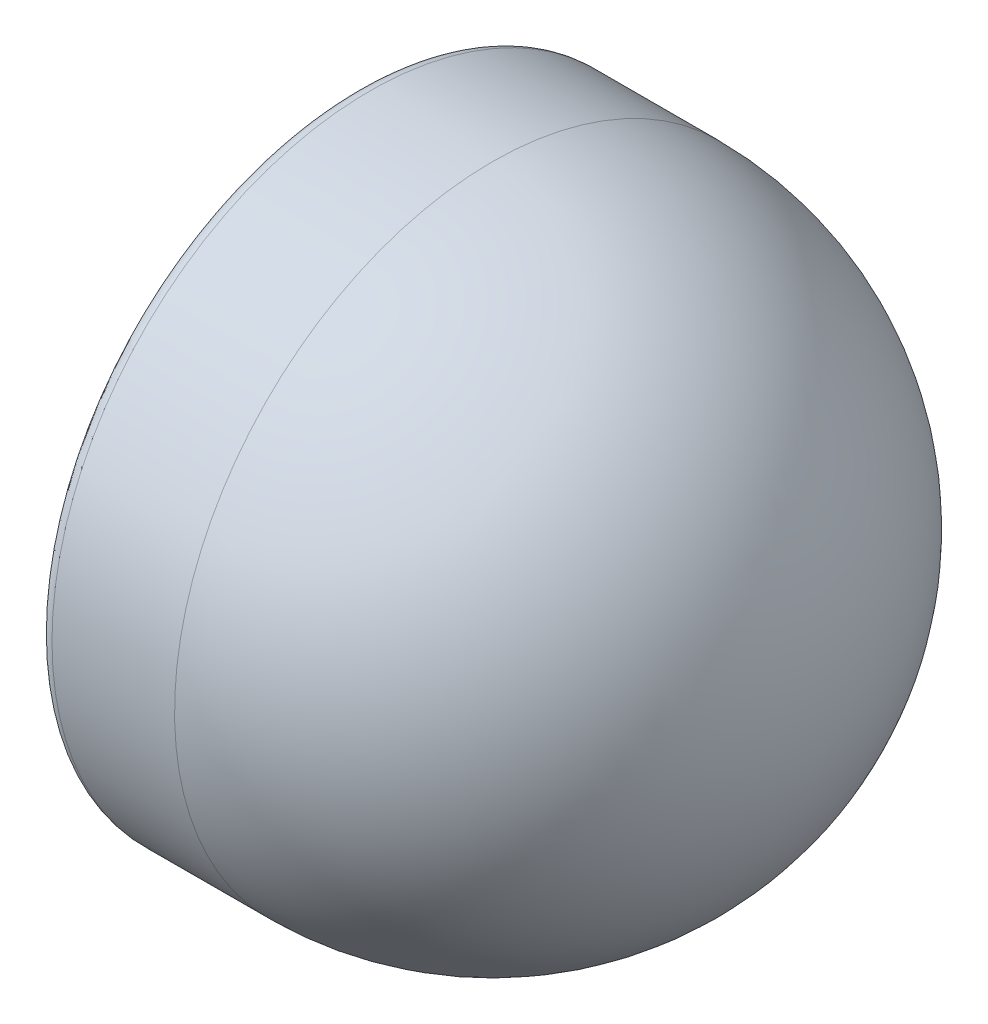
ISO-10303-21;
HEADER;
FILE_DESCRIPTION(('STEP AP214'),'2;1');
FILE_NAME('part.step','',(''),(''),'','','');
FILE_SCHEMA(('AUTOMOTIVE_DESIGN { 1 0 10303 214 1 1 1 1 }'));
ENDSEC;
DATA;
#1=APPLICATION_CONTEXT('core data for automotive mechanical design processes');
#2=APPLICATION_PROTOCOL_DEFINITION('international standard','automotive_design',2000,#1);
#3=PRODUCT_CONTEXT('',#1,'mechanical');
#4=PRODUCT('Part','Part','',(#3));
#5=PRODUCT_RELATED_PRODUCT_CATEGORY('part','',(#4));
#6=PRODUCT_DEFINITION_FORMATION('','',#4);
#7=PRODUCT_DEFINITION_CONTEXT('part definition',#1,'design');
#8=PRODUCT_DEFINITION('design','',#6,#7);
#9=PRODUCT_DEFINITION_SHAPE('','',#8);
#10=(LENGTH_UNIT() NAMED_UNIT(*) SI_UNIT(.MILLI.,.METRE.));
#11=(NAMED_UNIT(*) PLANE_ANGLE_UNIT() SI_UNIT($,.RADIAN.));
#12=(NAMED_UNIT(*) SI_UNIT($,.STERADIAN.) SOLID_ANGLE_UNIT());
#13=UNCERTAINTY_MEASURE_WITH_UNIT(LENGTH_MEASURE(1.E-05),#10,'distance_accuracy_value','');
#14=(GEOMETRIC_REPRESENTATION_CONTEXT(3) GLOBAL_UNCERTAINTY_ASSIGNED_CONTEXT((#13)) GLOBAL_UNIT_ASSIGNED_CONTEXT((#10,
#11,#12)) REPRESENTATION_CONTEXT('',''));
#15=CARTESIAN_POINT('',(0.,0.,0.));
#16=DIRECTION('',(0.,0.,1.));
#17=DIRECTION('',(1.,0.,0.));
#18=AXIS2_PLACEMENT_3D('',#15,#16,#17);
#19=CARTESIAN_POINT('',(-70.,0.,0.));
#20=DIRECTION('',(1.,0.,0.));
#21=DIRECTION('',(0.,1.,0.));
#22=AXIS2_PLACEMENT_3D('',#19,#20,#21);
#23=SPHERICAL_SURFACE('',#22,70.);
#24=CARTESIAN_POINT('',(-70.,0.,0.));
#25=DIRECTION('',(1.,0.,0.));
#26=DIRECTION('',(0.,0.,-1.));
#27=AXIS2_PLACEMENT_3D('',#24,#25,#26);
#28=CIRCLE('',#27,70.);
#29=CARTESIAN_POINT('',(-70.,0.,-70.));
#30=VERTEX_POINT('',#29);
#31=EDGE_CURVE('E10',#30,#30,#28,.T.);
#32=ORIENTED_EDGE('',*,*,#31,.T.);
#33=EDGE_LOOP('',(#32));
#34=FACE_BOUND('',#33,.T.);
#35=ADVANCED_FACE('F41',(#34),#23,.T.);
#36=CARTESIAN_POINT('',(0.,0.,0.));
#37=DIRECTION('',(1.,0.,0.));
#38=DIRECTION('',(0.,0.,-1.));
#39=AXIS2_PLACEMENT_3D('',#36,#37,#38);
#40=CYLINDRICAL_SURFACE('',#39,70.);
#41=CARTESIAN_POINT('',(-97.,0.,0.));
#42=DIRECTION('',(1.,0.,0.));
#43=DIRECTION('',(0.,0.,-1.));
#44=AXIS2_PLACEMENT_3D('',#41,#42,#43);
#45=CIRCLE('',#44,70.);
#46=CARTESIAN_POINT('',(-97.,0.,-70.));
#47=VERTEX_POINT('',#46);
#48=EDGE_CURVE('E48',#47,#47,#45,.T.);
#49=ORIENTED_EDGE('',*,*,#48,.T.);
#50=EDGE_LOOP('',(#49));
#51=FACE_BOUND('',#50,.T.);
#52=ORIENTED_EDGE('',*,*,#31,.F.);
#53=EDGE_LOOP('',(#52));
#54=FACE_BOUND('',#53,.T.);
#55=ADVANCED_FACE('F129',(#51,#54),#40,.T.);
#56=CARTESIAN_POINT('',(-97.,0.,0.));
#57=DIRECTION('',(1.,0.,0.));
#58=DIRECTION('',(0.,0.,-1.));
#59=AXIS2_PLACEMENT_3D('',#56,#57,#58);
#60=TOROIDAL_SURFACE('',#59,67.,3.);
#61=CARTESIAN_POINT('',(-100.,0.,0.));
#62=DIRECTION('',(1.,0.,0.));
#63=DIRECTION('',(0.,0.,-1.));
#64=AXIS2_PLACEMENT_3D('',#61,#62,#63);
#65=CIRCLE('',#64,67.);
#66=CARTESIAN_POINT('',(-100.,0.,-67.));
#67=VERTEX_POINT('',#66);
#68=EDGE_CURVE('E53',#67,#67,#65,.T.);
#69=ORIENTED_EDGE('',*,*,#68,.T.);
#70=EDGE_LOOP('',(#69));
#71=FACE_BOUND('',#70,.T.);
#72=ORIENTED_EDGE('',*,*,#48,.F.);
#73=EDGE_LOOP('',(#72));
#74=FACE_BOUND('',#73,.T.);
#75=ADVANCED_FACE('F133',(#71,#74),#60,.T.);
#76=CARTESIAN_POINT('',(-100.,67.,0.));
#77=DIRECTION('',(-1.,0.,0.));
#78=DIRECTION('',(0.,0.,1.));
#79=AXIS2_PLACEMENT_3D('',#76,#77,#78);
#80=PLANE('',#79);
#81=CARTESIAN_POINT('',(-100.,0.,0.));
#82=DIRECTION('',(1.,0.,0.));
#83=DIRECTION('',(0.,0.,-1.));
#84=AXIS2_PLACEMENT_3D('',#81,#82,#83);
#85=CIRCLE('',#84,61.5);
#86=CARTESIAN_POINT('',(-100.,0.,-61.5));
#87=VERTEX_POINT('',#86);
#88=EDGE_CURVE('E58',#87,#87,#85,.T.);
#89=ORIENTED_EDGE('',*,*,#88,.T.);
#90=EDGE_LOOP('',(#89));
#91=FACE_BOUND('',#90,.T.);
#92=ORIENTED_EDGE('',*,*,#68,.F.);
#93=EDGE_LOOP('',(#92));
#94=FACE_BOUND('',#93,.T.);
#95=ADVANCED_FACE('F137',(#91,#94),#80,.T.);
#96=CARTESIAN_POINT('',(-98.5,0.,0.));
#97=DIRECTION('',(1.,0.,0.));
#98=DIRECTION('',(0.,0.,-1.));
#99=AXIS2_PLACEMENT_3D('',#96,#97,#98);
#100=TOROIDAL_SURFACE('',#99,61.5,1.5);
#101=CARTESIAN_POINT('',(-98.5,0.,0.));
#102=DIRECTION('',(1.,0.,0.));
#103=DIRECTION('',(0.,0.,-1.));
#104=AXIS2_PLACEMENT_3D('',#101,#102,#103);
#105=CIRCLE('',#104,60.);
#106=CARTESIAN_POINT('',(-98.5,0.,-60.));
#107=VERTEX_POINT('',#106);
#108=EDGE_CURVE('E64',#107,#107,#105,.T.);
#109=ORIENTED_EDGE('',*,*,#108,.T.);
#110=EDGE_LOOP('',(#109));
#111=FACE_BOUND('',#110,.T.);
#112=ORIENTED_EDGE('',*,*,#88,.F.);
#113=EDGE_LOOP('',(#112));
#114=FACE_BOUND('',#113,.T.);
#115=ADVANCED_FACE('F144',(#111,#114),#100,.T.);
#116=CARTESIAN_POINT('',(0.,0.,0.));
#117=DIRECTION('',(1.,0.,0.));
#118=DIRECTION('',(0.,0.,-1.));
#119=AXIS2_PLACEMENT_3D('',#116,#117,#118);
#120=CYLINDRICAL_SURFACE('',#119,60.);
#121=CARTESIAN_POINT('',(-96.6213203435597,0.,0.));
#122=DIRECTION('',(1.,0.,0.));
#123=DIRECTION('',(0.,0.,-1.));
#124=AXIS2_PLACEMENT_3D('',#121,#122,#123);
#125=CIRCLE('',#124,60.);
#126=CARTESIAN_POINT('',(-96.6213203435597,0.,-60.));
#127=VERTEX_POINT('',#126);
#128=EDGE_CURVE('E68',#127,#127,#125,.T.);
#129=ORIENTED_EDGE('',*,*,#128,.T.);
#130=EDGE_LOOP('',(#129));
#131=FACE_BOUND('',#130,.T.);
#132=ORIENTED_EDGE('',*,*,#108,.F.);
#133=EDGE_LOOP('',(#132));
#134=FACE_BOUND('',#133,.T.);
#135=ADVANCED_FACE('F148',(#131,#134),#120,.F.);
#136=CARTESIAN_POINT('',(-96.6213203435597,0.,0.));
#137=DIRECTION('',(1.,0.,0.));
#138=DIRECTION('',(0.,0.,-1.));
#139=AXIS2_PLACEMENT_3D('',#136,#137,#138);
#140=TOROIDAL_SURFACE('',#139,61.5,1.5);
#141=CARTESIAN_POINT('',(-95.5606601717798,0.,0.));
#142=DIRECTION('',(1.,0.,0.));
#143=DIRECTION('',(0.,0.,-1.));
#144=AXIS2_PLACEMENT_3D('',#141,#142,#143);
#145=CIRCLE('',#144,60.4393398282202);
#146=CARTESIAN_POINT('',(-95.5606601717798,0.,-60.4393398282202));
#147=VERTEX_POINT('',#146);
#148=EDGE_CURVE('E72',#147,#147,#145,.T.);
#149=ORIENTED_EDGE('',*,*,#148,.T.);
#150=EDGE_LOOP('',(#149));
#151=FACE_BOUND('',#150,.T.);
#152=ORIENTED_EDGE('',*,*,#128,.F.);
#153=EDGE_LOOP('',(#152));
#154=FACE_BOUND('',#153,.T.);
#155=ADVANCED_FACE('F152',(#151,#154),#140,.T.);
#156=CARTESIAN_POINT('',(-95.5606601717798,0.,0.));
#157=DIRECTION('',(1.,0.,0.));
#158=DIRECTION('',(0.,0.,-1.));
#159=AXIS2_PLACEMENT_3D('',#156,#157,#158);
#160=CONICAL_SURFACE('',#159,60.4393398282202,0.785398163397447);
#161=CARTESIAN_POINT('',(-92.,0.,0.));
#162=DIRECTION('',(1.,0.,0.));
#163=DIRECTION('',(0.,0.,-1.));
#164=AXIS2_PLACEMENT_3D('',#161,#162,#163);
#165=CIRCLE('',#164,64.);
#166=CARTESIAN_POINT('',(-92.,0.,-64.));
#167=VERTEX_POINT('',#166);
#168=EDGE_CURVE('E76',#167,#167,#165,.T.);
#169=ORIENTED_EDGE('',*,*,#168,.T.);
#170=EDGE_LOOP('',(#169));
#171=FACE_BOUND('',#170,.T.);
#172=ORIENTED_EDGE('',*,*,#148,.F.);
#173=EDGE_LOOP('',(#172));
#174=FACE_BOUND('',#173,.T.);
#175=ADVANCED_FACE('F156',(#171,#174),#160,.F.);
#176=CARTESIAN_POINT('',(-92.,64.7071067811865,0.));
#177=DIRECTION('',(1.,0.,0.));
#178=DIRECTION('',(0.,0.,-1.));
#179=AXIS2_PLACEMENT_3D('',#176,#177,#178);
#180=PLANE('',#179);
#181=CARTESIAN_POINT('',(-92.,0.,0.));
#182=DIRECTION('',(1.,0.,0.));
#183=DIRECTION('',(0.,0.,-1.));
#184=AXIS2_PLACEMENT_3D('',#181,#182,#183);
#185=CIRCLE('',#184,64.7071067811865);
#186=CARTESIAN_POINT('',(-92.,0.,-64.7071067811865));
#187=VERTEX_POINT('',#186);
#188=EDGE_CURVE('E80',#187,#187,#185,.T.);
#189=ORIENTED_EDGE('',*,*,#188,.T.);
#190=EDGE_LOOP('',(#189));
#191=FACE_BOUND('',#190,.T.);
#192=ORIENTED_EDGE('',*,*,#168,.F.);
#193=EDGE_LOOP('',(#192));
#194=FACE_BOUND('',#193,.T.);
#195=ADVANCED_FACE('F160',(#191,#194),#180,.T.);
#196=CARTESIAN_POINT('',(0.,0.,0.));
#197=DIRECTION('',(1.,0.,0.));
#198=DIRECTION('',(0.,0.,-1.));
#199=AXIS2_PLACEMENT_3D('',#196,#197,#198);
#200=CYLINDRICAL_SURFACE('',#199,64.7071067811865);
#201=CARTESIAN_POINT('',(-92.7071067811866,0.,0.));
#202=DIRECTION('',(1.,0.,0.));
#203=DIRECTION('',(0.,0.,-1.));
#204=AXIS2_PLACEMENT_3D('',#201,#202,#203);
#205=CIRCLE('',#204,64.7071067811865);
#206=CARTESIAN_POINT('',(-92.7071067811866,0.,-64.7071067811865));
#207=VERTEX_POINT('',#206);
#208=EDGE_CURVE('E84',#207,#207,#205,.T.);
#209=ORIENTED_EDGE('',*,*,#208,.T.);
#210=EDGE_LOOP('',(#209));
#211=FACE_BOUND('',#210,.T.);
#212=ORIENTED_EDGE('',*,*,#188,.F.);
#213=EDGE_LOOP('',(#212));
#214=FACE_BOUND('',#213,.T.);
#215=ADVANCED_FACE('F164',(#211,#214),#200,.T.);
#216=CARTESIAN_POINT('',(-92.7071067811866,0.,0.));
#217=DIRECTION('',(1.,0.,0.));
#218=DIRECTION('',(0.,0.,-1.));
#219=AXIS2_PLACEMENT_3D('',#216,#217,#218);
#220=CONICAL_SURFACE('',#219,64.7071067811865,0.785398163397445);
#221=CARTESIAN_POINT('',(-96.2677669529664,0.,0.));
#222=DIRECTION('',(1.,0.,0.));
#223=DIRECTION('',(0.,0.,-1.));
#224=AXIS2_PLACEMENT_3D('',#221,#222,#223);
#225=CIRCLE('',#224,61.1464466094067);
#226=CARTESIAN_POINT('',(-96.2677669529664,0.,-61.1464466094067));
#227=VERTEX_POINT('',#226);
#228=EDGE_CURVE('E88',#227,#227,#225,.T.);
#229=ORIENTED_EDGE('',*,*,#228,.T.);
#230=EDGE_LOOP('',(#229));
#231=FACE_BOUND('',#230,.T.);
#232=ORIENTED_EDGE('',*,*,#208,.F.);
#233=EDGE_LOOP('',(#232));
#234=FACE_BOUND('',#233,.T.);
#235=ADVANCED_FACE('F168',(#231,#234),#220,.T.);
#236=CARTESIAN_POINT('',(-96.6213203435597,0.,0.));
#237=DIRECTION('',(1.,0.,0.));
#238=DIRECTION('',(0.,0.,-1.));
#239=AXIS2_PLACEMENT_3D('',#236,#237,#238);
#240=TOROIDAL_SURFACE('',#239,61.5,0.499999999999999);
#241=CARTESIAN_POINT('',(-96.6213203435597,0.,0.));
#242=DIRECTION('',(1.,0.,0.));
#243=DIRECTION('',(0.,0.,-1.));
#244=AXIS2_PLACEMENT_3D('',#241,#242,#243);
#245=CIRCLE('',#244,61.);
#246=CARTESIAN_POINT('',(-96.6213203435597,0.,-61.));
#247=VERTEX_POINT('',#246);
#248=EDGE_CURVE('E92',#247,#247,#245,.T.);
#249=ORIENTED_EDGE('',*,*,#248,.T.);
#250=EDGE_LOOP('',(#249));
#251=FACE_BOUND('',#250,.T.);
#252=ORIENTED_EDGE('',*,*,#228,.F.);
#253=EDGE_LOOP('',(#252));
#254=FACE_BOUND('',#253,.T.);
#255=ADVANCED_FACE('F172',(#251,#254),#240,.F.);
#256=CARTESIAN_POINT('',(0.,0.,0.));
#257=DIRECTION('',(1.,0.,0.));
#258=DIRECTION('',(0.,0.,-1.));
#259=AXIS2_PLACEMENT_3D('',#256,#257,#258);
#260=CYLINDRICAL_SURFACE('',#259,61.);
#261=CARTESIAN_POINT('',(-98.5,0.,0.));
#262=DIRECTION('',(1.,0.,0.));
#263=DIRECTION('',(0.,0.,-1.));
#264=AXIS2_PLACEMENT_3D('',#261,#262,#263);
#265=CIRCLE('',#264,61.);
#266=CARTESIAN_POINT('',(-98.5,0.,-61.));
#267=VERTEX_POINT('',#266);
#268=EDGE_CURVE('E96',#267,#267,#265,.T.);
#269=ORIENTED_EDGE('',*,*,#268,.T.);
#270=EDGE_LOOP('',(#269));
#271=FACE_BOUND('',#270,.T.);
#272=ORIENTED_EDGE('',*,*,#248,.F.);
#273=EDGE_LOOP('',(#272));
#274=FACE_BOUND('',#273,.T.);
#275=ADVANCED_FACE('F176',(#271,#274),#260,.T.);
#276=CARTESIAN_POINT('',(-98.5,0.,0.));
#277=DIRECTION('',(1.,0.,0.));
#278=DIRECTION('',(0.,0.,-1.));
#279=AXIS2_PLACEMENT_3D('',#276,#277,#278);
#280=TOROIDAL_SURFACE('',#279,61.5,0.5);
#281=CARTESIAN_POINT('',(-99.,0.,0.));
#282=DIRECTION('',(1.,0.,0.));
#283=DIRECTION('',(0.,0.,-1.));
#284=AXIS2_PLACEMENT_3D('',#281,#282,#283);
#285=CIRCLE('',#284,61.5);
#286=CARTESIAN_POINT('',(-99.,0.,-61.5));
#287=VERTEX_POINT('',#286);
#288=EDGE_CURVE('E100',#287,#287,#285,.T.);
#289=ORIENTED_EDGE('',*,*,#288,.T.);
#290=EDGE_LOOP('',(#289));
#291=FACE_BOUND('',#290,.T.);
#292=ORIENTED_EDGE('',*,*,#268,.F.);
#293=EDGE_LOOP('',(#292));
#294=FACE_BOUND('',#293,.T.);
#295=ADVANCED_FACE('F180',(#291,#294),#280,.F.);
#296=CARTESIAN_POINT('',(-99.,67.,0.));
#297=DIRECTION('',(1.,0.,0.));
#298=DIRECTION('',(0.,0.,-1.));
#299=AXIS2_PLACEMENT_3D('',#296,#297,#298);
#300=PLANE('',#299);
#301=CARTESIAN_POINT('',(-99.,0.,0.));
#302=DIRECTION('',(1.,0.,0.));
#303=DIRECTION('',(0.,0.,-1.));
#304=AXIS2_PLACEMENT_3D('',#301,#302,#303);
#305=CIRCLE('',#304,67.);
#306=CARTESIAN_POINT('',(-99.,0.,-67.));
#307=VERTEX_POINT('',#306);
#308=EDGE_CURVE('E104',#307,#307,#305,.T.);
#309=ORIENTED_EDGE('',*,*,#308,.T.);
#310=EDGE_LOOP('',(#309));
#311=FACE_BOUND('',#310,.T.);
#312=ORIENTED_EDGE('',*,*,#288,.F.);
#313=EDGE_LOOP('',(#312));
#314=FACE_BOUND('',#313,.T.);
#315=ADVANCED_FACE('F184',(#311,#314),#300,.T.);
#316=CARTESIAN_POINT('',(-97.,0.,0.));
#317=DIRECTION('',(1.,0.,0.));
#318=DIRECTION('',(0.,0.,-1.));
#319=AXIS2_PLACEMENT_3D('',#316,#317,#318);
#320=TOROIDAL_SURFACE('',#319,67.,2.00000000000001);
#321=CARTESIAN_POINT('',(-97.,0.,0.));
#322=DIRECTION('',(1.,0.,0.));
#323=DIRECTION('',(0.,0.,-1.));
#324=AXIS2_PLACEMENT_3D('',#321,#322,#323);
#325=CIRCLE('',#324,69.);
#326=CARTESIAN_POINT('',(-97.,0.,-69.));
#327=VERTEX_POINT('',#326);
#328=EDGE_CURVE('E108',#327,#327,#325,.T.);
#329=ORIENTED_EDGE('',*,*,#328,.T.);
#330=EDGE_LOOP('',(#329));
#331=FACE_BOUND('',#330,.T.);
#332=ORIENTED_EDGE('',*,*,#308,.F.);
#333=EDGE_LOOP('',(#332));
#334=FACE_BOUND('',#333,.T.);
#335=ADVANCED_FACE('F126',(#331,#334),#320,.F.);
#336=CARTESIAN_POINT('',(0.,0.,0.));
#337=DIRECTION('',(1.,0.,0.));
#338=DIRECTION('',(0.,0.,-1.));
#339=AXIS2_PLACEMENT_3D('',#336,#337,#338);
#340=CYLINDRICAL_SURFACE('',#339,69.);
#341=CARTESIAN_POINT('',(-70.,0.,0.));
#342=DIRECTION('',(1.,0.,0.));
#343=DIRECTION('',(0.,0.,-1.));
#344=AXIS2_PLACEMENT_3D('',#341,#342,#343);
#345=CIRCLE('',#344,69.);
#346=CARTESIAN_POINT('',(-70.,0.,-69.));
#347=VERTEX_POINT('',#346);
#348=EDGE_CURVE('E112',#347,#347,#345,.T.);
#349=ORIENTED_EDGE('',*,*,#348,.T.);
#350=EDGE_LOOP('',(#349));
#351=FACE_BOUND('',#350,.T.);
#352=ORIENTED_EDGE('',*,*,#328,.F.);
#353=EDGE_LOOP('',(#352));
#354=FACE_BOUND('',#353,.T.);
#355=ADVANCED_FACE('F117',(#351,#354),#340,.F.);
#356=CARTESIAN_POINT('',(-70.,0.,0.));
#357=DIRECTION('',(1.,0.,0.));
#358=DIRECTION('',(0.,1.,0.));
#359=AXIS2_PLACEMENT_3D('',#356,#357,#358);
#360=SPHERICAL_SURFACE('',#359,69.);
#361=ORIENTED_EDGE('',*,*,#348,.F.);
#362=EDGE_LOOP('',(#361));
#363=FACE_BOUND('',#362,.T.);
#364=ADVANCED_FACE('F120',(#363),#360,.F.);
#365=CLOSED_SHELL('',(#35,#55,#75,#95,#115,#135,#155,#175,#195,#215,#235,#255,#275,#295,#315,
#335,#355,#364));
#366=MANIFOLD_SOLID_BREP('B2',#365);
#367=ADVANCED_BREP_SHAPE_REPRESENTATION('',(#18,#366),#14);
#368=SHAPE_DEFINITION_REPRESENTATION(#9,#367);
ENDSEC;
END-ISO-10303-21;
